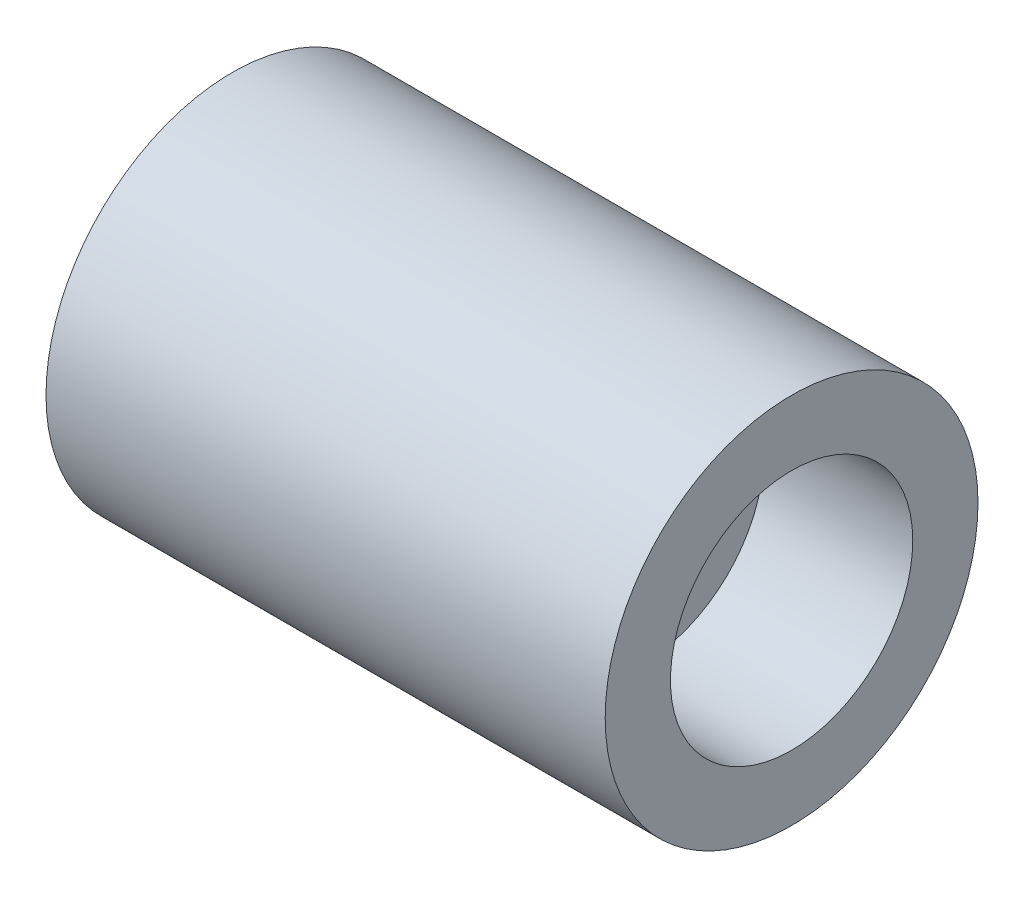
ISO-10303-21;
HEADER;
FILE_DESCRIPTION(('STEP AP214'),'2;1');
FILE_NAME('part.step','',(''),(''),'','','');
FILE_SCHEMA(('AUTOMOTIVE_DESIGN { 1 0 10303 214 1 1 1 1 }'));
ENDSEC;
DATA;
#1=APPLICATION_CONTEXT('core data for automotive mechanical design processes');
#2=APPLICATION_PROTOCOL_DEFINITION('international standard','automotive_design',2000,#1);
#3=PRODUCT_CONTEXT('',#1,'mechanical');
#4=PRODUCT('Part','Part','',(#3));
#5=PRODUCT_RELATED_PRODUCT_CATEGORY('part','',(#4));
#6=PRODUCT_DEFINITION_FORMATION('','',#4);
#7=PRODUCT_DEFINITION_CONTEXT('part definition',#1,'design');
#8=PRODUCT_DEFINITION('design','',#6,#7);
#9=PRODUCT_DEFINITION_SHAPE('','',#8);
#10=(LENGTH_UNIT() NAMED_UNIT(*) SI_UNIT(.MILLI.,.METRE.));
#11=(NAMED_UNIT(*) PLANE_ANGLE_UNIT() SI_UNIT($,.RADIAN.));
#12=(NAMED_UNIT(*) SI_UNIT($,.STERADIAN.) SOLID_ANGLE_UNIT());
#13=UNCERTAINTY_MEASURE_WITH_UNIT(LENGTH_MEASURE(1.E-05),#10,'distance_accuracy_value','');
#14=(GEOMETRIC_REPRESENTATION_CONTEXT(3) GLOBAL_UNCERTAINTY_ASSIGNED_CONTEXT((#13)) GLOBAL_UNIT_ASSIGNED_CONTEXT((#10,
#11,#12)) REPRESENTATION_CONTEXT('',''));
#15=CARTESIAN_POINT('',(0.,0.,0.));
#16=DIRECTION('',(0.,0.,1.));
#17=DIRECTION('',(1.,0.,0.));
#18=AXIS2_PLACEMENT_3D('',#15,#16,#17);
#19=CARTESIAN_POINT('',(0.,10.,0.));
#20=DIRECTION('',(-1.,0.,0.));
#21=DIRECTION('',(0.,0.,1.));
#22=AXIS2_PLACEMENT_3D('',#19,#20,#21);
#23=PLANE('',#22);
#24=CARTESIAN_POINT('',(0.,0.,0.));
#25=DIRECTION('',(1.,0.,0.));
#26=DIRECTION('',(0.,0.,-1.));
#27=AXIS2_PLACEMENT_3D('',#24,#25,#26);
#28=CIRCLE('',#27,4.5);
#29=CARTESIAN_POINT('',(0.,0.,-4.5));
#30=VERTEX_POINT('',#29);
#31=EDGE_CURVE('E38',#30,#30,#28,.T.);
#32=ORIENTED_EDGE('',*,*,#31,.T.);
#33=EDGE_LOOP('',(#32));
#34=FACE_BOUND('',#33,.T.);
#35=CARTESIAN_POINT('',(0.,0.,0.));
#36=DIRECTION('',(1.,0.,0.));
#37=DIRECTION('',(0.,0.,-1.));
#38=AXIS2_PLACEMENT_3D('',#35,#36,#37);
#39=CIRCLE('',#38,10.);
#40=CARTESIAN_POINT('',(0.,0.,-10.));
#41=VERTEX_POINT('',#40);
#42=EDGE_CURVE('E35',#41,#41,#39,.T.);
#43=ORIENTED_EDGE('',*,*,#42,.F.);
#44=EDGE_LOOP('',(#43));
#45=FACE_BOUND('',#44,.T.);
#46=ADVANCED_FACE('F15',(#34,#45),#23,.T.);
#47=CARTESIAN_POINT('',(30.,0.,0.));
#48=DIRECTION('',(1.,0.,0.));
#49=DIRECTION('',(0.,0.,-1.));
#50=AXIS2_PLACEMENT_3D('',#47,#48,#49);
#51=CYLINDRICAL_SURFACE('',#50,4.5);
#52=CARTESIAN_POINT('',(22.,0.,0.));
#53=DIRECTION('',(1.,0.,0.));
#54=DIRECTION('',(0.,0.,-1.));
#55=AXIS2_PLACEMENT_3D('',#52,#53,#54);
#56=CIRCLE('',#55,4.5);
#57=CARTESIAN_POINT('',(22.,0.,-4.5));
#58=VERTEX_POINT('',#57);
#59=EDGE_CURVE('E30',#58,#58,#56,.T.);
#60=ORIENTED_EDGE('',*,*,#59,.T.);
#61=EDGE_LOOP('',(#60));
#62=FACE_BOUND('',#61,.T.);
#63=ORIENTED_EDGE('',*,*,#31,.F.);
#64=EDGE_LOOP('',(#63));
#65=FACE_BOUND('',#64,.T.);
#66=ADVANCED_FACE('F44',(#62,#65),#51,.F.);
#67=CARTESIAN_POINT('',(30.,0.,0.));
#68=DIRECTION('',(1.,0.,0.));
#69=DIRECTION('',(0.,0.,-1.));
#70=AXIS2_PLACEMENT_3D('',#67,#68,#69);
#71=CYLINDRICAL_SURFACE('',#70,10.);
#72=ORIENTED_EDGE('',*,*,#42,.T.);
#73=EDGE_LOOP('',(#72));
#74=FACE_BOUND('',#73,.T.);
#75=CARTESIAN_POINT('',(30.,0.,0.));
#76=DIRECTION('',(1.,0.,0.));
#77=DIRECTION('',(0.,0.,-1.));
#78=AXIS2_PLACEMENT_3D('',#75,#76,#77);
#79=CIRCLE('',#78,10.);
#80=CARTESIAN_POINT('',(30.,0.,-10.));
#81=VERTEX_POINT('',#80);
#82=EDGE_CURVE('E26',#81,#81,#79,.T.);
#83=ORIENTED_EDGE('',*,*,#82,.F.);
#84=EDGE_LOOP('',(#83));
#85=FACE_BOUND('',#84,.T.);
#86=ADVANCED_FACE('F46',(#74,#85),#71,.T.);
#87=CARTESIAN_POINT('',(22.,4.5,0.));
#88=DIRECTION('',(1.,0.,0.));
#89=DIRECTION('',(0.,0.,-1.));
#90=AXIS2_PLACEMENT_3D('',#87,#88,#89);
#91=PLANE('',#90);
#92=CARTESIAN_POINT('',(22.,0.,0.));
#93=DIRECTION('',(1.,0.,0.));
#94=DIRECTION('',(0.,0.,-1.));
#95=AXIS2_PLACEMENT_3D('',#92,#93,#94);
#96=CIRCLE('',#95,6.5);
#97=CARTESIAN_POINT('',(22.,0.,-6.5));
#98=VERTEX_POINT('',#97);
#99=EDGE_CURVE('E22',#98,#98,#96,.T.);
#100=ORIENTED_EDGE('',*,*,#99,.T.);
#101=EDGE_LOOP('',(#100));
#102=FACE_BOUND('',#101,.T.);
#103=ORIENTED_EDGE('',*,*,#59,.F.);
#104=EDGE_LOOP('',(#103));
#105=FACE_BOUND('',#104,.T.);
#106=ADVANCED_FACE('F54',(#102,#105),#91,.T.);
#107=CARTESIAN_POINT('',(30.,6.5,0.));
#108=DIRECTION('',(1.,0.,0.));
#109=DIRECTION('',(0.,0.,-1.));
#110=AXIS2_PLACEMENT_3D('',#107,#108,#109);
#111=PLANE('',#110);
#112=ORIENTED_EDGE('',*,*,#82,.T.);
#113=EDGE_LOOP('',(#112));
#114=FACE_BOUND('',#113,.T.);
#115=CARTESIAN_POINT('',(30.,0.,0.));
#116=DIRECTION('',(1.,0.,0.));
#117=DIRECTION('',(0.,0.,-1.));
#118=AXIS2_PLACEMENT_3D('',#115,#116,#117);
#119=CIRCLE('',#118,6.5);
#120=CARTESIAN_POINT('',(30.,0.,-6.5));
#121=VERTEX_POINT('',#120);
#122=EDGE_CURVE('E10',#121,#121,#119,.T.);
#123=ORIENTED_EDGE('',*,*,#122,.F.);
#124=EDGE_LOOP('',(#123));
#125=FACE_BOUND('',#124,.T.);
#126=ADVANCED_FACE('F60',(#114,#125),#111,.T.);
#127=CARTESIAN_POINT('',(30.,0.,0.));
#128=DIRECTION('',(1.,0.,0.));
#129=DIRECTION('',(0.,0.,-1.));
#130=AXIS2_PLACEMENT_3D('',#127,#128,#129);
#131=CYLINDRICAL_SURFACE('',#130,6.5);
#132=ORIENTED_EDGE('',*,*,#122,.T.);
#133=EDGE_LOOP('',(#132));
#134=FACE_BOUND('',#133,.T.);
#135=ORIENTED_EDGE('',*,*,#99,.F.);
#136=EDGE_LOOP('',(#135));
#137=FACE_BOUND('',#136,.T.);
#138=ADVANCED_FACE('F17',(#134,#137),#131,.F.);
#139=CLOSED_SHELL('',(#46,#66,#86,#106,#126,#138));
#140=MANIFOLD_SOLID_BREP('B1',#139);
#141=ADVANCED_BREP_SHAPE_REPRESENTATION('',(#18,#140),#14);
#142=SHAPE_DEFINITION_REPRESENTATION(#9,#141);
ENDSEC;
END-ISO-10303-21;
